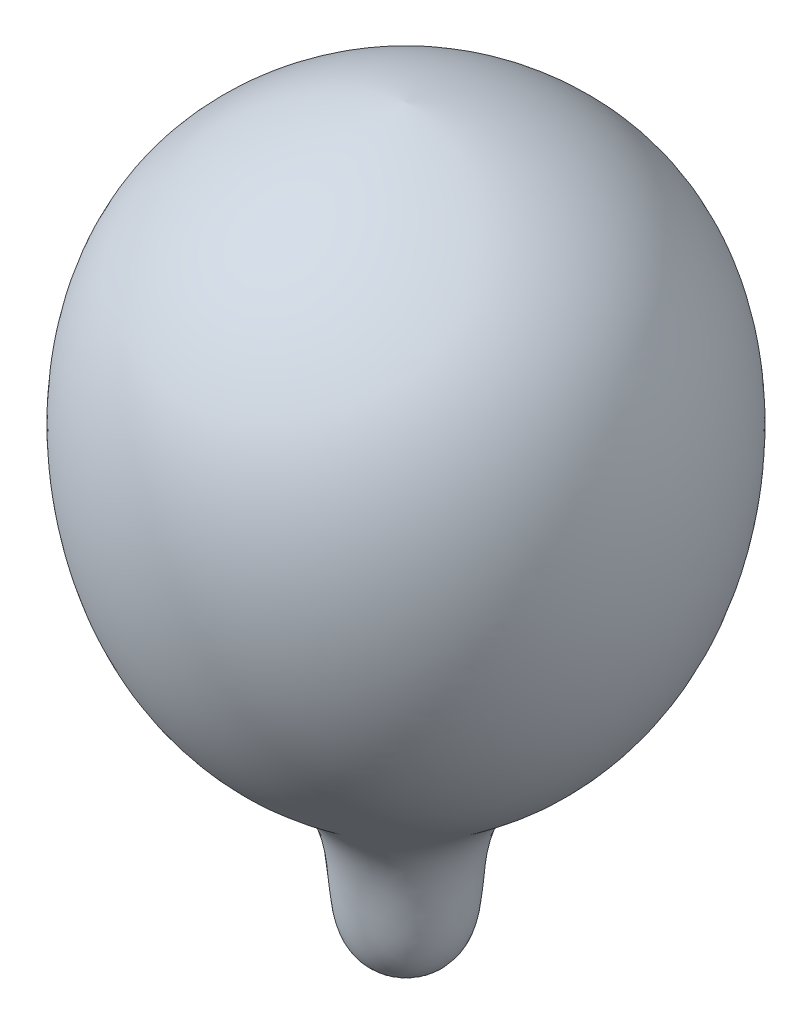
ISO-10303-21;
HEADER;
FILE_DESCRIPTION(('STEP AP214'),'2;1');
FILE_NAME('part.step','',(''),(''),'','','');
FILE_SCHEMA(('AUTOMOTIVE_DESIGN { 1 0 10303 214 1 1 1 1 }'));
ENDSEC;
DATA;
#1=APPLICATION_CONTEXT('core data for automotive mechanical design processes');
#2=APPLICATION_PROTOCOL_DEFINITION('international standard','automotive_design',2000,#1);
#3=PRODUCT_CONTEXT('',#1,'mechanical');
#4=PRODUCT('Part','Part','',(#3));
#5=PRODUCT_RELATED_PRODUCT_CATEGORY('part','',(#4));
#6=PRODUCT_DEFINITION_FORMATION('','',#4);
#7=PRODUCT_DEFINITION_CONTEXT('part definition',#1,'design');
#8=PRODUCT_DEFINITION('design','',#6,#7);
#9=PRODUCT_DEFINITION_SHAPE('','',#8);
#10=(LENGTH_UNIT() NAMED_UNIT(*) SI_UNIT(.MILLI.,.METRE.));
#11=(NAMED_UNIT(*) PLANE_ANGLE_UNIT() SI_UNIT($,.RADIAN.));
#12=(NAMED_UNIT(*) SI_UNIT($,.STERADIAN.) SOLID_ANGLE_UNIT());
#13=UNCERTAINTY_MEASURE_WITH_UNIT(LENGTH_MEASURE(1.E-05),#10,'distance_accuracy_value','');
#14=(GEOMETRIC_REPRESENTATION_CONTEXT(3) GLOBAL_UNCERTAINTY_ASSIGNED_CONTEXT((#13)) GLOBAL_UNIT_ASSIGNED_CONTEXT((#10,
#11,#12)) REPRESENTATION_CONTEXT('',''));
#15=CARTESIAN_POINT('',(0.,0.,0.));
#16=DIRECTION('',(0.,0.,1.));
#17=DIRECTION('',(1.,0.,0.));
#18=AXIS2_PLACEMENT_3D('',#15,#16,#17);
#19=CARTESIAN_POINT('',(0.,154.376673304483,0.));
#20=CARTESIAN_POINT('',(50.789597847671,148.745853306795,0.));
#21=CARTESIAN_POINT('',(163.901108385365,96.344780466351,0.));
#22=CARTESIAN_POINT('',(181.828978108357,-79.7737779520762,0.));
#23=CARTESIAN_POINT('',(121.334705064717,-195.77021944438,0.));
#24=CARTESIAN_POINT('',(45.7715643236545,-239.569847756163,0.));
#25=CARTESIAN_POINT('',(33.8172198190777,-300.688291190064,0.));
#26=CARTESIAN_POINT('',(37.7024537625026,-340.346171960474,0.));
#27=CARTESIAN_POINT('',(0.,-347.294734483324,0.));
#28=B_SPLINE_CURVE_WITH_KNOTS('',3,(#19,#20,#21,#22,#23,#24,#25,#26,#27),.UNSPECIFIED.,.F.,.F.,
(4,1,1,1,1,1,4),(0.,0.244025510814199,0.50563315280237,0.717447362938872,0.831783835041673,
0.876368215459015,1.),.UNSPECIFIED.);
#29=CARTESIAN_POINT('',(0.,154.376673304483,0.));
#30=DIRECTION('',(0.,1.,0.));
#31=AXIS1_PLACEMENT('',#29,#30);
#32=SURFACE_OF_REVOLUTION('',#28,#31);
#33=CARTESIAN_POINT('',(0.,-347.294734483324,0.));
#34=VERTEX_POINT('',#33);
#35=VERTEX_LOOP('',#34);
#36=FACE_BOUND('',#35,.T.);
#37=CARTESIAN_POINT('',(0.,154.376673304483,0.));
#38=VERTEX_POINT('',#37);
#39=VERTEX_LOOP('',#38);
#40=FACE_BOUND('',#39,.T.);
#41=ADVANCED_FACE('F40',(#36,#40),#32,.F.);
#42=CLOSED_SHELL('',(#41));
#43=MANIFOLD_SOLID_BREP('B2',#42);
#44=ADVANCED_BREP_SHAPE_REPRESENTATION('',(#18,#43),#14);
#45=SHAPE_DEFINITION_REPRESENTATION(#9,#44);
ENDSEC;
END-ISO-10303-21;
